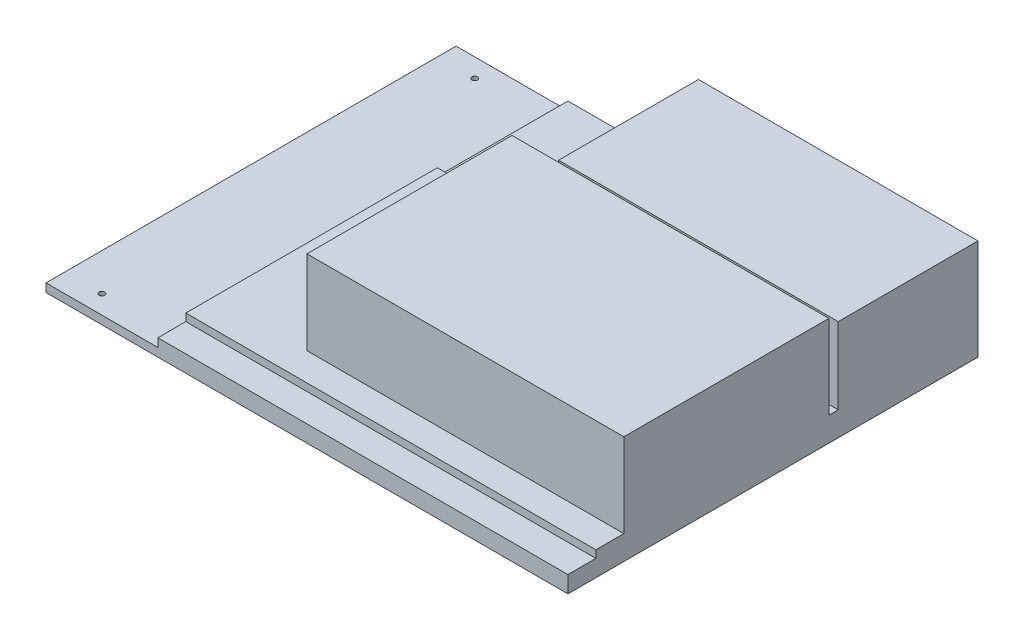
ISO-10303-21;
HEADER;
FILE_DESCRIPTION(('STEP AP214'),'2;1');
FILE_NAME('part.step','',(''),(''),'','','');
FILE_SCHEMA(('AUTOMOTIVE_DESIGN { 1 0 10303 214 1 1 1 1 }'));
ENDSEC;
DATA;
#1=APPLICATION_CONTEXT('core data for automotive mechanical design processes');
#2=APPLICATION_PROTOCOL_DEFINITION('international standard','automotive_design',2000,#1);
#3=PRODUCT_CONTEXT('',#1,'mechanical');
#4=PRODUCT('Part','Part','',(#3));
#5=PRODUCT_RELATED_PRODUCT_CATEGORY('part','',(#4));
#6=PRODUCT_DEFINITION_FORMATION('','',#4);
#7=PRODUCT_DEFINITION_CONTEXT('part definition',#1,'design');
#8=PRODUCT_DEFINITION('design','',#6,#7);
#9=PRODUCT_DEFINITION_SHAPE('','',#8);
#10=(LENGTH_UNIT() NAMED_UNIT(*) SI_UNIT(.MILLI.,.METRE.));
#11=(NAMED_UNIT(*) PLANE_ANGLE_UNIT() SI_UNIT($,.RADIAN.));
#12=(NAMED_UNIT(*) SI_UNIT($,.STERADIAN.) SOLID_ANGLE_UNIT());
#13=UNCERTAINTY_MEASURE_WITH_UNIT(LENGTH_MEASURE(1.E-05),#10,'distance_accuracy_value','');
#14=(GEOMETRIC_REPRESENTATION_CONTEXT(3) GLOBAL_UNCERTAINTY_ASSIGNED_CONTEXT((#13)) GLOBAL_UNIT_ASSIGNED_CONTEXT((#10,
#11,#12)) REPRESENTATION_CONTEXT('',''));
#15=CARTESIAN_POINT('',(0.,0.,0.));
#16=DIRECTION('',(0.,0.,1.));
#17=DIRECTION('',(1.,0.,0.));
#18=AXIS2_PLACEMENT_3D('',#15,#16,#17);
#19=CARTESIAN_POINT('',(0.,8.5,0.));
#20=DIRECTION('',(0.,1.,0.));
#21=DIRECTION('',(0.,0.,1.));
#22=AXIS2_PLACEMENT_3D('',#19,#20,#21);
#23=PLANE('',#22);
#24=DIRECTION('',(0.,0.,-1.));
#25=VECTOR('',#24,1.);
#26=CARTESIAN_POINT('',(91.6981132075472,8.5,133.490566037736));
#27=LINE('',#26,#25);
#28=CARTESIAN_POINT('',(91.6981132075472,8.5,133.490566037736));
#29=VERTEX_POINT('',#28);
#30=CARTESIAN_POINT('',(91.6981132075472,8.5,118.490566037736));
#31=VERTEX_POINT('',#30);
#32=EDGE_CURVE('E323',#29,#31,#27,.T.);
#33=ORIENTED_EDGE('',*,*,#32,.T.);
#34=DIRECTION('',(1.,0.,0.));
#35=VECTOR('',#34,1.);
#36=CARTESIAN_POINT('',(-78.3018867924528,8.5,118.490566037736));
#37=LINE('',#36,#35);
#38=CARTESIAN_POINT('',(-78.3018867924528,8.5,118.490566037736));
#39=VERTEX_POINT('',#38);
#40=EDGE_CURVE('E52',#39,#31,#37,.T.);
#41=ORIENTED_EDGE('',*,*,#40,.F.);
#42=DIRECTION('',(0.,0.,1.));
#43=VECTOR('',#42,1.);
#44=CARTESIAN_POINT('',(-78.3018867924528,8.5,8.4905660377359));
#45=LINE('',#44,#43);
#46=CARTESIAN_POINT('',(-78.3018867924528,8.5,8.4905660377359));
#47=VERTEX_POINT('',#46);
#48=EDGE_CURVE('E57',#47,#39,#45,.T.);
#49=ORIENTED_EDGE('',*,*,#48,.F.);
#50=DIRECTION('',(-1.,0.,0.));
#51=VECTOR('',#50,1.);
#52=CARTESIAN_POINT('',(-78.3018867924528,8.5,8.4905660377359));
#53=LINE('',#52,#51);
#54=CARTESIAN_POINT('',(91.6981132075472,8.5,8.4905660377359));
#55=VERTEX_POINT('',#54);
#56=EDGE_CURVE('E367',#55,#47,#53,.T.);
#57=ORIENTED_EDGE('',*,*,#56,.F.);
#58=CARTESIAN_POINT('',(91.6981132075472,8.5,3.4905660377359));
#59=VERTEX_POINT('',#58);
#60=EDGE_CURVE('E325',#55,#59,#27,.T.);
#61=ORIENTED_EDGE('',*,*,#60,.T.);
#62=DIRECTION('',(-1.,0.,0.));
#63=VECTOR('',#62,1.);
#64=CARTESIAN_POINT('',(0.,8.5,3.49056603773591));
#65=LINE('',#64,#63);
#66=CARTESIAN_POINT('',(-58.3018867924528,8.5,3.49056603773591));
#67=VERTEX_POINT('',#66);
#68=EDGE_CURVE('E44',#59,#67,#65,.T.);
#69=ORIENTED_EDGE('',*,*,#68,.T.);
#70=DIRECTION('',(0.,0.,-1.));
#71=VECTOR('',#70,1.);
#72=CARTESIAN_POINT('',(-58.3018867924528,8.5,0.));
#73=LINE('',#72,#71);
#74=CARTESIAN_POINT('',(-58.3018867924528,8.5,-1.50943396226406));
#75=VERTEX_POINT('',#74);
#76=EDGE_CURVE('E11',#67,#75,#73,.T.);
#77=ORIENTED_EDGE('',*,*,#76,.T.);
#78=DIRECTION('',(-1.,0.,0.));
#79=VECTOR('',#78,1.);
#80=CARTESIAN_POINT('',(91.6981132075472,8.5,-1.50943396226408));
#81=LINE('',#80,#79);
#82=CARTESIAN_POINT('',(-128.301886792453,8.5,-1.50943396226405));
#83=VERTEX_POINT('',#82);
#84=EDGE_CURVE('E320',#75,#83,#81,.T.);
#85=ORIENTED_EDGE('',*,*,#84,.T.);
#86=DIRECTION('',(0.,0.,1.));
#87=VECTOR('',#86,1.);
#88=CARTESIAN_POINT('',(-128.301886792453,8.5,-1.50943396226405));
#89=LINE('',#88,#87);
#90=CARTESIAN_POINT('',(-128.301886792453,8.5,133.490566037736));
#91=VERTEX_POINT('',#90);
#92=EDGE_CURVE('E328',#83,#91,#89,.T.);
#93=ORIENTED_EDGE('',*,*,#92,.T.);
#94=DIRECTION('',(1.,0.,0.));
#95=VECTOR('',#94,1.);
#96=CARTESIAN_POINT('',(-128.301886792453,8.5,133.490566037736));
#97=LINE('',#96,#95);
#98=EDGE_CURVE('E326',#91,#29,#97,.T.);
#99=ORIENTED_EDGE('',*,*,#98,.T.);
#100=EDGE_LOOP('',(#33,#41,#49,#57,#61,#69,#77,#85,#93,#99));
#101=FACE_BOUND('',#100,.T.);
#102=ADVANCED_FACE('F35',(#101),#23,.T.);
#103=CARTESIAN_POINT('',(0.,4.5,0.));
#104=DIRECTION('',(0.,1.,0.));
#105=DIRECTION('',(0.,0.,1.));
#106=AXIS2_PLACEMENT_3D('',#103,#104,#105);
#107=PLANE('',#106);
#108=DIRECTION('',(-1.,0.,0.));
#109=VECTOR('',#108,1.);
#110=CARTESIAN_POINT('',(91.6981132075472,4.5,-1.50943396226408));
#111=LINE('',#110,#109);
#112=CARTESIAN_POINT('',(-58.3018867924529,4.5,-1.50943396226406));
#113=VERTEX_POINT('',#112);
#114=CARTESIAN_POINT('',(-128.301886792453,4.5,-1.50943396226406));
#115=VERTEX_POINT('',#114);
#116=EDGE_CURVE('E315',#113,#115,#111,.T.);
#117=ORIENTED_EDGE('',*,*,#116,.F.);
#118=DIRECTION('',(0.,0.,1.));
#119=VECTOR('',#118,1.);
#120=CARTESIAN_POINT('',(-58.3018867924528,4.5,-71.5094339622641));
#121=LINE('',#120,#119);
#122=CARTESIAN_POINT('',(-58.3018867924528,4.5,-71.5094339622641));
#123=VERTEX_POINT('',#122);
#124=EDGE_CURVE('E343',#123,#113,#121,.T.);
#125=ORIENTED_EDGE('',*,*,#124,.F.);
#126=DIRECTION('',(-1.,0.,0.));
#127=VECTOR('',#126,1.);
#128=CARTESIAN_POINT('',(-128.301886792453,4.5,-71.5094339622641));
#129=LINE('',#128,#127);
#130=CARTESIAN_POINT('',(-128.301886792453,4.5,-71.5094339622641));
#131=VERTEX_POINT('',#130);
#132=EDGE_CURVE('E294',#123,#131,#129,.T.);
#133=ORIENTED_EDGE('',*,*,#132,.T.);
#134=DIRECTION('',(0.,0.,1.));
#135=VECTOR('',#134,1.);
#136=CARTESIAN_POINT('',(-128.301886792453,4.5,-71.5094339622641));
#137=LINE('',#136,#135);
#138=EDGE_CURVE('E282',#131,#115,#137,.T.);
#139=ORIENTED_EDGE('',*,*,#138,.T.);
#140=EDGE_LOOP('',(#117,#125,#133,#139));
#141=FACE_BOUND('',#140,.T.);
#142=ADVANCED_FACE('F240',(#141),#107,.T.);
#143=CARTESIAN_POINT('',(91.6981132075472,8.5,-1.50943396226408));
#144=DIRECTION('',(0.,0.,1.));
#145=DIRECTION('',(1.,0.,0.));
#146=AXIS2_PLACEMENT_3D('',#143,#144,#145);
#147=PLANE('',#146);
#148=DIRECTION('',(0.,1.,0.));
#149=VECTOR('',#148,1.);
#150=CARTESIAN_POINT('',(-58.3018867924528,8.5,-1.50943396226406));
#151=LINE('',#150,#149);
#152=EDGE_CURVE('E316',#113,#75,#151,.T.);
#153=ORIENTED_EDGE('',*,*,#152,.F.);
#154=ORIENTED_EDGE('',*,*,#116,.T.);
#155=DIRECTION('',(0.,-1.,0.));
#156=VECTOR('',#155,1.);
#157=CARTESIAN_POINT('',(-128.301886792453,8.5,-1.50943396226405));
#158=LINE('',#157,#156);
#159=EDGE_CURVE('E322',#83,#115,#158,.T.);
#160=ORIENTED_EDGE('',*,*,#159,.F.);
#161=ORIENTED_EDGE('',*,*,#84,.F.);
#162=EDGE_LOOP('',(#153,#154,#160,#161));
#163=FACE_BOUND('',#162,.T.);
#164=ADVANCED_FACE('F245',(#163),#147,.F.);
#165=CARTESIAN_POINT('',(-128.301886792453,4.5,-71.5094339622641));
#166=DIRECTION('',(1.,0.,0.));
#167=DIRECTION('',(0.,0.,-1.));
#168=AXIS2_PLACEMENT_3D('',#165,#166,#167);
#169=PLANE('',#168);
#170=DIRECTION('',(0.,0.,1.));
#171=VECTOR('',#170,1.);
#172=CARTESIAN_POINT('',(-128.301886792453,0.,-71.5094339622641));
#173=LINE('',#172,#171);
#174=CARTESIAN_POINT('',(-128.301886792453,0.,-71.5094339622641));
#175=VERTEX_POINT('',#174);
#176=CARTESIAN_POINT('',(-128.301886792453,0.,148.490566037736));
#177=VERTEX_POINT('',#176);
#178=EDGE_CURVE('E201',#175,#177,#173,.T.);
#179=ORIENTED_EDGE('',*,*,#178,.T.);
#180=DIRECTION('',(0.,-1.,0.));
#181=VECTOR('',#180,1.);
#182=CARTESIAN_POINT('',(-128.301886792453,4.5,148.490566037736));
#183=LINE('',#182,#181);
#184=CARTESIAN_POINT('',(-128.301886792453,4.5,148.490566037736));
#185=VERTEX_POINT('',#184);
#186=EDGE_CURVE('E276',#185,#177,#183,.T.);
#187=ORIENTED_EDGE('',*,*,#186,.F.);
#188=CARTESIAN_POINT('',(-128.301886792453,4.5,133.490566037736));
#189=VERTEX_POINT('',#188);
#190=EDGE_CURVE('E279',#189,#185,#137,.T.);
#191=ORIENTED_EDGE('',*,*,#190,.F.);
#192=DIRECTION('',(0.,-1.,0.));
#193=VECTOR('',#192,1.);
#194=CARTESIAN_POINT('',(-128.301886792453,8.5,133.490566037736));
#195=LINE('',#194,#193);
#196=EDGE_CURVE('E280',#91,#189,#195,.T.);
#197=ORIENTED_EDGE('',*,*,#196,.F.);
#198=ORIENTED_EDGE('',*,*,#92,.F.);
#199=ORIENTED_EDGE('',*,*,#159,.T.);
#200=ORIENTED_EDGE('',*,*,#138,.F.);
#201=DIRECTION('',(0.,-1.,0.));
#202=VECTOR('',#201,1.);
#203=CARTESIAN_POINT('',(-128.301886792453,4.5,-71.5094339622641));
#204=LINE('',#203,#202);
#205=EDGE_CURVE('E278',#131,#175,#204,.T.);
#206=ORIENTED_EDGE('',*,*,#205,.T.);
#207=EDGE_LOOP('',(#179,#187,#191,#197,#198,#199,#200,#206));
#208=FACE_BOUND('',#207,.T.);
#209=ADVANCED_FACE('F37',(#208),#169,.F.);
#210=CARTESIAN_POINT('',(-128.301886792453,4.5,148.490566037736));
#211=DIRECTION('',(0.,0.,-1.));
#212=DIRECTION('',(-1.,0.,0.));
#213=AXIS2_PLACEMENT_3D('',#210,#211,#212);
#214=PLANE('',#213);
#215=ORIENTED_EDGE('',*,*,#186,.T.);
#216=DIRECTION('',(-1.,0.,0.));
#217=VECTOR('',#216,1.);
#218=CARTESIAN_POINT('',(91.6981132075472,0.,148.490566037736));
#219=LINE('',#218,#217);
#220=CARTESIAN_POINT('',(-188.301886792453,0.,148.490566037736));
#221=VERTEX_POINT('',#220);
#222=EDGE_CURVE('E180',#177,#221,#219,.T.);
#223=ORIENTED_EDGE('',*,*,#222,.T.);
#224=DIRECTION('',(0.,1.,0.));
#225=VECTOR('',#224,1.);
#226=CARTESIAN_POINT('',(-188.301886792453,-4.5,148.490566037736));
#227=LINE('',#226,#225);
#228=CARTESIAN_POINT('',(-188.301886792453,-4.5,148.490566037736));
#229=VERTEX_POINT('',#228);
#230=EDGE_CURVE('E160',#229,#221,#227,.T.);
#231=ORIENTED_EDGE('',*,*,#230,.F.);
#232=DIRECTION('',(-1.,0.,0.));
#233=VECTOR('',#232,1.);
#234=CARTESIAN_POINT('',(91.6981132075472,-4.5,148.490566037736));
#235=LINE('',#234,#233);
#236=CARTESIAN_POINT('',(91.6981132075472,-4.5,148.490566037736));
#237=VERTEX_POINT('',#236);
#238=EDGE_CURVE('E167',#237,#229,#235,.T.);
#239=ORIENTED_EDGE('',*,*,#238,.F.);
#240=DIRECTION('',(0.,-1.,0.));
#241=VECTOR('',#240,1.);
#242=CARTESIAN_POINT('',(91.6981132075472,4.5,148.490566037736));
#243=LINE('',#242,#241);
#244=CARTESIAN_POINT('',(91.6981132075472,4.5,148.490566037736));
#245=VERTEX_POINT('',#244);
#246=EDGE_CURVE('E297',#245,#237,#243,.T.);
#247=ORIENTED_EDGE('',*,*,#246,.F.);
#248=DIRECTION('',(1.,0.,0.));
#249=VECTOR('',#248,1.);
#250=CARTESIAN_POINT('',(-128.301886792453,4.5,148.490566037736));
#251=LINE('',#250,#249);
#252=EDGE_CURVE('E301',#185,#245,#251,.T.);
#253=ORIENTED_EDGE('',*,*,#252,.F.);
#254=EDGE_LOOP('',(#215,#223,#231,#239,#247,#253));
#255=FACE_BOUND('',#254,.T.);
#256=ADVANCED_FACE('F179',(#255),#214,.F.);
#257=CARTESIAN_POINT('',(91.6981132075471,4.5,-71.5094339622641));
#258=DIRECTION('',(-1.,0.,0.));
#259=DIRECTION('',(0.,0.,1.));
#260=AXIS2_PLACEMENT_3D('',#257,#258,#259);
#261=PLANE('',#260);
#262=DIRECTION('',(0.,-1.,0.));
#263=VECTOR('',#262,1.);
#264=CARTESIAN_POINT('',(91.6981132075471,49.5,3.49056603773591));
#265=LINE('',#264,#263);
#266=CARTESIAN_POINT('',(91.6981132075471,49.5,3.49056603773591));
#267=VERTEX_POINT('',#266);
#268=EDGE_CURVE('E336',#267,#59,#265,.T.);
#269=ORIENTED_EDGE('',*,*,#268,.T.);
#270=ORIENTED_EDGE('',*,*,#60,.F.);
#271=DIRECTION('',(0.,-1.,0.));
#272=VECTOR('',#271,1.);
#273=CARTESIAN_POINT('',(91.6981132075472,53.5,8.4905660377359));
#274=LINE('',#273,#272);
#275=CARTESIAN_POINT('',(91.6981132075472,53.5,8.4905660377359));
#276=VERTEX_POINT('',#275);
#277=EDGE_CURVE('E360',#276,#55,#274,.T.);
#278=ORIENTED_EDGE('',*,*,#277,.F.);
#279=DIRECTION('',(0.,0.,-1.));
#280=VECTOR('',#279,1.);
#281=CARTESIAN_POINT('',(91.6981132075472,53.5,8.4905660377359));
#282=LINE('',#281,#280);
#283=CARTESIAN_POINT('',(91.6981132075472,53.5,118.490566037736));
#284=VERTEX_POINT('',#283);
#285=EDGE_CURVE('E372',#284,#276,#282,.T.);
#286=ORIENTED_EDGE('',*,*,#285,.F.);
#287=DIRECTION('',(0.,-1.,0.));
#288=VECTOR('',#287,1.);
#289=CARTESIAN_POINT('',(91.6981132075472,53.5,118.490566037736));
#290=LINE('',#289,#288);
#291=EDGE_CURVE('E357',#284,#31,#290,.T.);
#292=ORIENTED_EDGE('',*,*,#291,.T.);
#293=ORIENTED_EDGE('',*,*,#32,.F.);
#294=DIRECTION('',(0.,-1.,0.));
#295=VECTOR('',#294,1.);
#296=CARTESIAN_POINT('',(91.6981132075472,8.5,133.490566037736));
#297=LINE('',#296,#295);
#298=CARTESIAN_POINT('',(91.6981132075472,4.5,133.490566037736));
#299=VERTEX_POINT('',#298);
#300=EDGE_CURVE('E285',#29,#299,#297,.T.);
#301=ORIENTED_EDGE('',*,*,#300,.T.);
#302=DIRECTION('',(0.,0.,-1.));
#303=VECTOR('',#302,1.);
#304=CARTESIAN_POINT('',(91.6981132075471,4.5,-71.5094339622641));
#305=LINE('',#304,#303);
#306=EDGE_CURVE('E309',#245,#299,#305,.T.);
#307=ORIENTED_EDGE('',*,*,#306,.F.);
#308=ORIENTED_EDGE('',*,*,#246,.T.);
#309=DIRECTION('',(0.,0.,-1.));
#310=VECTOR('',#309,1.);
#311=CARTESIAN_POINT('',(91.6981132075472,-4.5,148.490566037736));
#312=LINE('',#311,#310);
#313=CARTESIAN_POINT('',(91.6981132075472,-4.5,-71.5094339622641));
#314=VERTEX_POINT('',#313);
#315=EDGE_CURVE('E173',#237,#314,#312,.T.);
#316=ORIENTED_EDGE('',*,*,#315,.T.);
#317=DIRECTION('',(0.,-1.,0.));
#318=VECTOR('',#317,1.);
#319=CARTESIAN_POINT('',(91.6981132075471,4.5,-71.5094339622641));
#320=LINE('',#319,#318);
#321=CARTESIAN_POINT('',(91.6981132075472,49.5,-71.5094339622641));
#322=VERTEX_POINT('',#321);
#323=EDGE_CURVE('E207',#322,#314,#320,.T.);
#324=ORIENTED_EDGE('',*,*,#323,.F.);
#325=DIRECTION('',(0.,0.,-1.));
#326=VECTOR('',#325,1.);
#327=CARTESIAN_POINT('',(91.6981132075472,49.5,-71.5094339622641));
#328=LINE('',#327,#326);
#329=EDGE_CURVE('E349',#267,#322,#328,.T.);
#330=ORIENTED_EDGE('',*,*,#329,.F.);
#331=EDGE_LOOP('',(#269,#270,#278,#286,#292,#293,#301,#307,#308,#316,#324,#330));
#332=FACE_BOUND('',#331,.T.);
#333=ADVANCED_FACE('F264',(#332),#261,.F.);
#334=CARTESIAN_POINT('',(-128.301886792453,4.5,-71.5094339622641));
#335=DIRECTION('',(0.,0.,1.));
#336=DIRECTION('',(1.,0.,0.));
#337=AXIS2_PLACEMENT_3D('',#334,#335,#336);
#338=PLANE('',#337);
#339=ORIENTED_EDGE('',*,*,#323,.T.);
#340=DIRECTION('',(-1.,0.,0.));
#341=VECTOR('',#340,1.);
#342=CARTESIAN_POINT('',(91.6981132075472,-4.5,-71.5094339622641));
#343=LINE('',#342,#341);
#344=CARTESIAN_POINT('',(-188.301886792453,-4.5,-71.5094339622641));
#345=VERTEX_POINT('',#344);
#346=EDGE_CURVE('E166',#314,#345,#343,.T.);
#347=ORIENTED_EDGE('',*,*,#346,.T.);
#348=DIRECTION('',(0.,1.,0.));
#349=VECTOR('',#348,1.);
#350=CARTESIAN_POINT('',(-188.301886792453,-4.5,-71.5094339622641));
#351=LINE('',#350,#349);
#352=CARTESIAN_POINT('',(-188.301886792453,0.,-71.5094339622641));
#353=VERTEX_POINT('',#352);
#354=EDGE_CURVE('E162',#345,#353,#351,.T.);
#355=ORIENTED_EDGE('',*,*,#354,.T.);
#356=DIRECTION('',(-1.,0.,0.));
#357=VECTOR('',#356,1.);
#358=CARTESIAN_POINT('',(91.6981132075472,0.,-71.5094339622641));
#359=LINE('',#358,#357);
#360=EDGE_CURVE('E176',#175,#353,#359,.T.);
#361=ORIENTED_EDGE('',*,*,#360,.F.);
#362=ORIENTED_EDGE('',*,*,#205,.F.);
#363=ORIENTED_EDGE('',*,*,#132,.F.);
#364=DIRECTION('',(0.,-1.,0.));
#365=VECTOR('',#364,1.);
#366=CARTESIAN_POINT('',(-58.3018867924528,49.5,-71.5094339622641));
#367=LINE('',#366,#365);
#368=CARTESIAN_POINT('',(-58.3018867924528,49.5,-71.5094339622641));
#369=VERTEX_POINT('',#368);
#370=EDGE_CURVE('E339',#369,#123,#367,.T.);
#371=ORIENTED_EDGE('',*,*,#370,.F.);
#372=DIRECTION('',(-1.,0.,0.));
#373=VECTOR('',#372,1.);
#374=CARTESIAN_POINT('',(-58.3018867924528,49.5,-71.5094339622641));
#375=LINE('',#374,#373);
#376=EDGE_CURVE('E342',#322,#369,#375,.T.);
#377=ORIENTED_EDGE('',*,*,#376,.F.);
#378=EDGE_LOOP('',(#339,#347,#355,#361,#362,#363,#371,#377));
#379=FACE_BOUND('',#378,.T.);
#380=ADVANCED_FACE('F205',(#379),#338,.F.);
#381=DIRECTION('',(1.,0.,0.));
#382=VECTOR('',#381,1.);
#383=CARTESIAN_POINT('',(-128.301886792453,4.5,133.490566037736));
#384=LINE('',#383,#382);
#385=EDGE_CURVE('E312',#189,#299,#384,.T.);
#386=ORIENTED_EDGE('',*,*,#385,.F.);
#387=ORIENTED_EDGE('',*,*,#190,.T.);
#388=ORIENTED_EDGE('',*,*,#252,.T.);
#389=ORIENTED_EDGE('',*,*,#306,.T.);
#390=EDGE_LOOP('',(#386,#387,#388,#389));
#391=FACE_BOUND('',#390,.T.);
#392=ADVANCED_FACE('F248',(#391),#107,.T.);
#393=CARTESIAN_POINT('',(-128.301886792453,8.5,133.490566037736));
#394=DIRECTION('',(0.,0.,-1.));
#395=DIRECTION('',(-1.,0.,0.));
#396=AXIS2_PLACEMENT_3D('',#393,#394,#395);
#397=PLANE('',#396);
#398=ORIENTED_EDGE('',*,*,#385,.T.);
#399=ORIENTED_EDGE('',*,*,#300,.F.);
#400=ORIENTED_EDGE('',*,*,#98,.F.);
#401=ORIENTED_EDGE('',*,*,#196,.T.);
#402=EDGE_LOOP('',(#398,#399,#400,#401));
#403=FACE_BOUND('',#402,.T.);
#404=ADVANCED_FACE('F256',(#403),#397,.F.);
#405=CARTESIAN_POINT('',(-58.3018867924528,49.5,-71.5094339622641));
#406=DIRECTION('',(1.,0.,0.));
#407=DIRECTION('',(0.,0.,-1.));
#408=AXIS2_PLACEMENT_3D('',#405,#406,#407);
#409=PLANE('',#408);
#410=ORIENTED_EDGE('',*,*,#124,.T.);
#411=ORIENTED_EDGE('',*,*,#152,.T.);
#412=ORIENTED_EDGE('',*,*,#76,.F.);
#413=DIRECTION('',(0.,-1.,0.));
#414=VECTOR('',#413,1.);
#415=CARTESIAN_POINT('',(-58.3018867924528,49.5,3.49056603773591));
#416=LINE('',#415,#414);
#417=CARTESIAN_POINT('',(-58.3018867924528,49.5,3.49056603773591));
#418=VERTEX_POINT('',#417);
#419=EDGE_CURVE('E333',#418,#67,#416,.T.);
#420=ORIENTED_EDGE('',*,*,#419,.F.);
#421=DIRECTION('',(0.,0.,1.));
#422=VECTOR('',#421,1.);
#423=CARTESIAN_POINT('',(-58.3018867924528,49.5,-71.5094339622641));
#424=LINE('',#423,#422);
#425=EDGE_CURVE('E346',#369,#418,#424,.T.);
#426=ORIENTED_EDGE('',*,*,#425,.F.);
#427=ORIENTED_EDGE('',*,*,#370,.T.);
#428=EDGE_LOOP('',(#410,#411,#412,#420,#426,#427));
#429=FACE_BOUND('',#428,.T.);
#430=ADVANCED_FACE('F251',(#429),#409,.F.);
#431=CARTESIAN_POINT('',(-58.3018867924528,49.5,3.49056603773591));
#432=DIRECTION('',(0.,0.,-1.));
#433=DIRECTION('',(-1.,0.,0.));
#434=AXIS2_PLACEMENT_3D('',#431,#432,#433);
#435=PLANE('',#434);
#436=ORIENTED_EDGE('',*,*,#68,.F.);
#437=ORIENTED_EDGE('',*,*,#268,.F.);
#438=DIRECTION('',(1.,0.,0.));
#439=VECTOR('',#438,1.);
#440=CARTESIAN_POINT('',(-58.3018867924528,49.5,3.49056603773591));
#441=LINE('',#440,#439);
#442=EDGE_CURVE('E352',#418,#267,#441,.T.);
#443=ORIENTED_EDGE('',*,*,#442,.F.);
#444=ORIENTED_EDGE('',*,*,#419,.T.);
#445=EDGE_LOOP('',(#436,#437,#443,#444));
#446=FACE_BOUND('',#445,.T.);
#447=ADVANCED_FACE('F396',(#446),#435,.F.);
#448=CARTESIAN_POINT('',(0.,49.5,0.));
#449=DIRECTION('',(0.,1.,0.));
#450=DIRECTION('',(0.,0.,1.));
#451=AXIS2_PLACEMENT_3D('',#448,#449,#450);
#452=PLANE('',#451);
#453=ORIENTED_EDGE('',*,*,#425,.T.);
#454=ORIENTED_EDGE('',*,*,#442,.T.);
#455=ORIENTED_EDGE('',*,*,#329,.T.);
#456=ORIENTED_EDGE('',*,*,#376,.T.);
#457=EDGE_LOOP('',(#453,#454,#455,#456));
#458=FACE_BOUND('',#457,.T.);
#459=ADVANCED_FACE('F401',(#458),#452,.T.);
#460=CARTESIAN_POINT('',(-78.3018867924528,53.5,8.4905660377359));
#461=DIRECTION('',(1.,0.,0.));
#462=DIRECTION('',(0.,0.,-1.));
#463=AXIS2_PLACEMENT_3D('',#460,#461,#462);
#464=PLANE('',#463);
#465=ORIENTED_EDGE('',*,*,#48,.T.);
#466=DIRECTION('',(0.,-1.,0.));
#467=VECTOR('',#466,1.);
#468=CARTESIAN_POINT('',(-78.3018867924528,53.5,118.490566037736));
#469=LINE('',#468,#467);
#470=CARTESIAN_POINT('',(-78.3018867924528,53.5,118.490566037736));
#471=VERTEX_POINT('',#470);
#472=EDGE_CURVE('E347',#471,#39,#469,.T.);
#473=ORIENTED_EDGE('',*,*,#472,.F.);
#474=DIRECTION('',(0.,0.,1.));
#475=VECTOR('',#474,1.);
#476=CARTESIAN_POINT('',(-78.3018867924528,53.5,8.4905660377359));
#477=LINE('',#476,#475);
#478=CARTESIAN_POINT('',(-78.3018867924528,53.5,8.4905660377359));
#479=VERTEX_POINT('',#478);
#480=EDGE_CURVE('E369',#479,#471,#477,.T.);
#481=ORIENTED_EDGE('',*,*,#480,.F.);
#482=DIRECTION('',(0.,-1.,0.));
#483=VECTOR('',#482,1.);
#484=CARTESIAN_POINT('',(-78.3018867924528,53.5,8.4905660377359));
#485=LINE('',#484,#483);
#486=EDGE_CURVE('E363',#479,#47,#485,.T.);
#487=ORIENTED_EDGE('',*,*,#486,.T.);
#488=EDGE_LOOP('',(#465,#473,#481,#487));
#489=FACE_BOUND('',#488,.T.);
#490=ADVANCED_FACE('F384',(#489),#464,.F.);
#491=CARTESIAN_POINT('',(-78.3018867924528,53.5,118.490566037736));
#492=DIRECTION('',(0.,0.,-1.));
#493=DIRECTION('',(-1.,0.,0.));
#494=AXIS2_PLACEMENT_3D('',#491,#492,#493);
#495=PLANE('',#494);
#496=ORIENTED_EDGE('',*,*,#40,.T.);
#497=ORIENTED_EDGE('',*,*,#291,.F.);
#498=DIRECTION('',(1.,0.,0.));
#499=VECTOR('',#498,1.);
#500=CARTESIAN_POINT('',(-78.3018867924528,53.5,118.490566037736));
#501=LINE('',#500,#499);
#502=EDGE_CURVE('E374',#471,#284,#501,.T.);
#503=ORIENTED_EDGE('',*,*,#502,.F.);
#504=ORIENTED_EDGE('',*,*,#472,.T.);
#505=EDGE_LOOP('',(#496,#497,#503,#504));
#506=FACE_BOUND('',#505,.T.);
#507=ADVANCED_FACE('F386',(#506),#495,.F.);
#508=CARTESIAN_POINT('',(-78.3018867924528,53.5,8.4905660377359));
#509=DIRECTION('',(0.,0.,1.));
#510=DIRECTION('',(1.,0.,0.));
#511=AXIS2_PLACEMENT_3D('',#508,#509,#510);
#512=PLANE('',#511);
#513=ORIENTED_EDGE('',*,*,#56,.T.);
#514=ORIENTED_EDGE('',*,*,#486,.F.);
#515=DIRECTION('',(-1.,0.,0.));
#516=VECTOR('',#515,1.);
#517=CARTESIAN_POINT('',(-78.3018867924528,53.5,8.4905660377359));
#518=LINE('',#517,#516);
#519=EDGE_CURVE('E366',#276,#479,#518,.T.);
#520=ORIENTED_EDGE('',*,*,#519,.F.);
#521=ORIENTED_EDGE('',*,*,#277,.T.);
#522=EDGE_LOOP('',(#513,#514,#520,#521));
#523=FACE_BOUND('',#522,.T.);
#524=ADVANCED_FACE('F391',(#523),#512,.F.);
#525=CARTESIAN_POINT('',(0.,53.5,0.));
#526=DIRECTION('',(0.,1.,0.));
#527=DIRECTION('',(0.,0.,1.));
#528=AXIS2_PLACEMENT_3D('',#525,#526,#527);
#529=PLANE('',#528);
#530=ORIENTED_EDGE('',*,*,#480,.T.);
#531=ORIENTED_EDGE('',*,*,#502,.T.);
#532=ORIENTED_EDGE('',*,*,#285,.T.);
#533=ORIENTED_EDGE('',*,*,#519,.T.);
#534=EDGE_LOOP('',(#530,#531,#532,#533));
#535=FACE_BOUND('',#534,.T.);
#536=ADVANCED_FACE('F379',(#535),#529,.T.);
#537=CARTESIAN_POINT('',(-188.301886792453,-4.5,148.490566037736));
#538=DIRECTION('',(1.,0.,0.));
#539=DIRECTION('',(0.,0.,-1.));
#540=AXIS2_PLACEMENT_3D('',#537,#538,#539);
#541=PLANE('',#540);
#542=DIRECTION('',(0.,0.,-1.));
#543=VECTOR('',#542,1.);
#544=CARTESIAN_POINT('',(-188.301886792453,0.,148.490566037736));
#545=LINE('',#544,#543);
#546=EDGE_CURVE('E189',#221,#353,#545,.T.);
#547=ORIENTED_EDGE('',*,*,#546,.T.);
#548=ORIENTED_EDGE('',*,*,#354,.F.);
#549=DIRECTION('',(0.,0.,-1.));
#550=VECTOR('',#549,1.);
#551=CARTESIAN_POINT('',(-188.301886792453,-4.5,148.490566037736));
#552=LINE('',#551,#550);
#553=EDGE_CURVE('E155',#229,#345,#552,.T.);
#554=ORIENTED_EDGE('',*,*,#553,.F.);
#555=ORIENTED_EDGE('',*,*,#230,.T.);
#556=EDGE_LOOP('',(#547,#548,#554,#555));
#557=FACE_BOUND('',#556,.T.);
#558=ADVANCED_FACE('F158',(#557),#541,.F.);
#559=CARTESIAN_POINT('',(0.,-4.5,0.));
#560=DIRECTION('',(0.,-1.,0.));
#561=DIRECTION('',(0.,0.,-1.));
#562=AXIS2_PLACEMENT_3D('',#559,#560,#561);
#563=PLANE('',#562);
#564=CARTESIAN_POINT('',(-168.301886792453,-4.5,138.490566037736));
#565=DIRECTION('',(0.,-1.,0.));
#566=DIRECTION('',(0.,0.,-1.));
#567=AXIS2_PLACEMENT_3D('',#564,#565,#566);
#568=CIRCLE('',#567,1.5);
#569=CARTESIAN_POINT('',(-168.301886792453,-4.5,136.990566037736));
#570=VERTEX_POINT('',#569);
#571=EDGE_CURVE('E214',#570,#570,#568,.T.);
#572=ORIENTED_EDGE('',*,*,#571,.F.);
#573=EDGE_LOOP('',(#572));
#574=FACE_BOUND('',#573,.T.);
#575=CARTESIAN_POINT('',(-168.301886792453,-4.5,-61.5094339622641));
#576=DIRECTION('',(0.,-1.,0.));
#577=DIRECTION('',(0.,0.,-1.));
#578=AXIS2_PLACEMENT_3D('',#575,#576,#577);
#579=CIRCLE('',#578,1.5);
#580=CARTESIAN_POINT('',(-168.301886792453,-4.5,-63.0094339622641));
#581=VERTEX_POINT('',#580);
#582=EDGE_CURVE('E190',#581,#581,#579,.T.);
#583=ORIENTED_EDGE('',*,*,#582,.F.);
#584=EDGE_LOOP('',(#583));
#585=FACE_BOUND('',#584,.T.);
#586=ORIENTED_EDGE('',*,*,#238,.T.);
#587=ORIENTED_EDGE('',*,*,#553,.T.);
#588=ORIENTED_EDGE('',*,*,#346,.F.);
#589=ORIENTED_EDGE('',*,*,#315,.F.);
#590=EDGE_LOOP('',(#586,#587,#588,#589));
#591=FACE_BOUND('',#590,.T.);
#592=ADVANCED_FACE('F171',(#574,#585,#591),#563,.T.);
#593=CARTESIAN_POINT('',(0.,0.,0.));
#594=DIRECTION('',(0.,-1.,0.));
#595=DIRECTION('',(0.,0.,-1.));
#596=AXIS2_PLACEMENT_3D('',#593,#594,#595);
#597=PLANE('',#596);
#598=CARTESIAN_POINT('',(-168.301886792453,0.,138.490566037736));
#599=DIRECTION('',(0.,1.,0.));
#600=DIRECTION('',(0.,0.,1.));
#601=AXIS2_PLACEMENT_3D('',#598,#599,#600);
#602=CIRCLE('',#601,1.5);
#603=CARTESIAN_POINT('',(-168.301886792453,0.,139.990566037736));
#604=VERTEX_POINT('',#603);
#605=EDGE_CURVE('E217',#604,#604,#602,.T.);
#606=ORIENTED_EDGE('',*,*,#605,.F.);
#607=EDGE_LOOP('',(#606));
#608=FACE_BOUND('',#607,.T.);
#609=CARTESIAN_POINT('',(-168.301886792453,0.,-61.5094339622641));
#610=DIRECTION('',(0.,1.,0.));
#611=DIRECTION('',(0.,0.,1.));
#612=AXIS2_PLACEMENT_3D('',#609,#610,#611);
#613=CIRCLE('',#612,1.5);
#614=CARTESIAN_POINT('',(-168.301886792453,0.,-60.0094339622641));
#615=VERTEX_POINT('',#614);
#616=EDGE_CURVE('E211',#615,#615,#613,.T.);
#617=ORIENTED_EDGE('',*,*,#616,.F.);
#618=EDGE_LOOP('',(#617));
#619=FACE_BOUND('',#618,.T.);
#620=ORIENTED_EDGE('',*,*,#178,.F.);
#621=ORIENTED_EDGE('',*,*,#360,.T.);
#622=ORIENTED_EDGE('',*,*,#546,.F.);
#623=ORIENTED_EDGE('',*,*,#222,.F.);
#624=EDGE_LOOP('',(#620,#621,#622,#623));
#625=FACE_BOUND('',#624,.T.);
#626=ADVANCED_FACE('F199',(#608,#619,#625),#597,.F.);
#627=CARTESIAN_POINT('',(-168.301886792453,-10.,-61.5094339622641));
#628=DIRECTION('',(0.,1.,0.));
#629=DIRECTION('',(0.,0.,1.));
#630=AXIS2_PLACEMENT_3D('',#627,#628,#629);
#631=CYLINDRICAL_SURFACE('',#630,1.5);
#632=ORIENTED_EDGE('',*,*,#582,.T.);
#633=EDGE_LOOP('',(#632));
#634=FACE_BOUND('',#633,.T.);
#635=ORIENTED_EDGE('',*,*,#616,.T.);
#636=EDGE_LOOP('',(#635));
#637=FACE_BOUND('',#636,.T.);
#638=ADVANCED_FACE('F225',(#634,#637),#631,.F.);
#639=CARTESIAN_POINT('',(-168.301886792453,-10.,138.490566037736));
#640=DIRECTION('',(0.,1.,0.));
#641=DIRECTION('',(0.,0.,1.));
#642=AXIS2_PLACEMENT_3D('',#639,#640,#641);
#643=CYLINDRICAL_SURFACE('',#642,1.5);
#644=ORIENTED_EDGE('',*,*,#571,.T.);
#645=EDGE_LOOP('',(#644));
#646=FACE_BOUND('',#645,.T.);
#647=ORIENTED_EDGE('',*,*,#605,.T.);
#648=EDGE_LOOP('',(#647));
#649=FACE_BOUND('',#648,.T.);
#650=ADVANCED_FACE('F221',(#646,#649),#643,.F.);
#651=CLOSED_SHELL('',(#102,#142,#164,#209,#256,#333,#380,#392,#404,#430,#447,#459,#490,#507,
#524,#536,#558,#592,#626,#638,#650));
#652=MANIFOLD_SOLID_BREP('B2',#651);
#653=ADVANCED_BREP_SHAPE_REPRESENTATION('',(#18,#652),#14);
#654=SHAPE_DEFINITION_REPRESENTATION(#9,#653);
ENDSEC;
END-ISO-10303-21;
